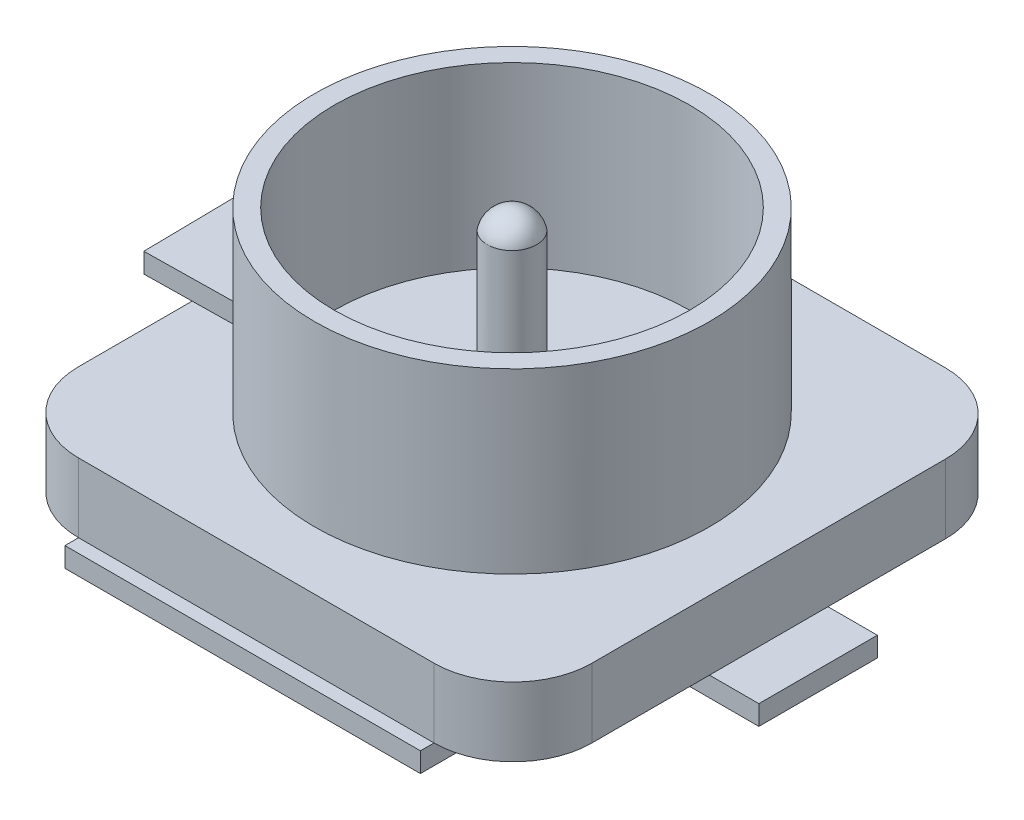
ISO-10303-21;
HEADER;
FILE_DESCRIPTION(('STEP AP214'),'2;1');
FILE_NAME('part.step','',(''),(''),'','','');
FILE_SCHEMA(('AUTOMOTIVE_DESIGN { 1 0 10303 214 1 1 1 1 }'));
ENDSEC;
DATA;
#1=APPLICATION_CONTEXT('core data for automotive mechanical design processes');
#2=APPLICATION_PROTOCOL_DEFINITION('international standard','automotive_design',2000,#1);
#3=PRODUCT_CONTEXT('',#1,'mechanical');
#4=PRODUCT('Part','Part','',(#3));
#5=PRODUCT_RELATED_PRODUCT_CATEGORY('part','',(#4));
#6=PRODUCT_DEFINITION_FORMATION('','',#4);
#7=PRODUCT_DEFINITION_CONTEXT('part definition',#1,'design');
#8=PRODUCT_DEFINITION('design','',#6,#7);
#9=PRODUCT_DEFINITION_SHAPE('','',#8);
#10=(LENGTH_UNIT() NAMED_UNIT(*) SI_UNIT(.MILLI.,.METRE.));
#11=(NAMED_UNIT(*) PLANE_ANGLE_UNIT() SI_UNIT($,.RADIAN.));
#12=(NAMED_UNIT(*) SI_UNIT($,.STERADIAN.) SOLID_ANGLE_UNIT());
#13=UNCERTAINTY_MEASURE_WITH_UNIT(LENGTH_MEASURE(1.E-05),#10,'distance_accuracy_value','');
#14=(GEOMETRIC_REPRESENTATION_CONTEXT(3) GLOBAL_UNCERTAINTY_ASSIGNED_CONTEXT((#13)) GLOBAL_UNIT_ASSIGNED_CONTEXT((#10,
#11,#12)) REPRESENTATION_CONTEXT('',''));
#15=CARTESIAN_POINT('',(0.,0.,0.));
#16=DIRECTION('',(0.,0.,1.));
#17=DIRECTION('',(1.,0.,0.));
#18=AXIS2_PLACEMENT_3D('',#15,#16,#17);
#19=CARTESIAN_POINT('',(0.899999999999999,0.,0.895));
#20=DIRECTION('',(0.,-1.,0.));
#21=DIRECTION('',(0.,0.,-1.));
#22=AXIS2_PLACEMENT_3D('',#19,#20,#21);
#23=PLANE('',#22);
#24=DIRECTION('',(1.,0.,0.));
#25=VECTOR('',#24,1.);
#26=CARTESIAN_POINT('',(0.,0.,0.3));
#27=LINE('',#26,#25);
#28=CARTESIAN_POINT('',(0.264575131106459,0.,0.3));
#29=VERTEX_POINT('',#28);
#30=CARTESIAN_POINT('',(1.3,0.,0.3));
#31=VERTEX_POINT('',#30);
#32=EDGE_CURVE('E272',#29,#31,#27,.T.);
#33=ORIENTED_EDGE('',*,*,#32,.T.);
#34=DIRECTION('',(0.,0.,-1.));
#35=VECTOR('',#34,1.);
#36=CARTESIAN_POINT('',(1.3,0.,0.894999999999997));
#37=LINE('',#36,#35);
#38=CARTESIAN_POINT('',(1.3,0.,0.894999999999997));
#39=VERTEX_POINT('',#38);
#40=EDGE_CURVE('E392',#39,#31,#37,.T.);
#41=ORIENTED_EDGE('',*,*,#40,.F.);
#42=CARTESIAN_POINT('',(0.899999999999999,0.,0.895));
#43=DIRECTION('',(0.,1.,0.));
#44=DIRECTION('',(0.,0.,-1.));
#45=AXIS2_PLACEMENT_3D('',#42,#43,#44);
#46=CIRCLE('',#45,0.4);
#47=CARTESIAN_POINT('',(0.899999999999996,0.,1.295));
#48=VERTEX_POINT('',#47);
#49=EDGE_CURVE('E368',#48,#39,#46,.T.);
#50=ORIENTED_EDGE('',*,*,#49,.F.);
#51=DIRECTION('',(0.,0.,1.));
#52=VECTOR('',#51,1.);
#53=CARTESIAN_POINT('',(0.9,0.,1.36376329659594));
#54=LINE('',#53,#52);
#55=CARTESIAN_POINT('',(0.9,0.,1.05));
#56=VERTEX_POINT('',#55);
#57=EDGE_CURVE('E343',#56,#48,#54,.T.);
#58=ORIENTED_EDGE('',*,*,#57,.F.);
#59=DIRECTION('',(1.,0.,0.));
#60=VECTOR('',#59,1.);
#61=CARTESIAN_POINT('',(-0.899999999999999,0.,1.05));
#62=LINE('',#61,#60);
#63=CARTESIAN_POINT('',(-0.899999999999999,0.,1.05));
#64=VERTEX_POINT('',#63);
#65=EDGE_CURVE('E338',#64,#56,#62,.T.);
#66=ORIENTED_EDGE('',*,*,#65,.F.);
#67=DIRECTION('',(0.,0.,-1.));
#68=VECTOR('',#67,1.);
#69=CARTESIAN_POINT('',(-0.899999999999999,0.,1.36376329659594));
#70=LINE('',#69,#68);
#71=CARTESIAN_POINT('',(-0.899999999999998,0.,1.295));
#72=VERTEX_POINT('',#71);
#73=EDGE_CURVE('E339',#72,#64,#70,.T.);
#74=ORIENTED_EDGE('',*,*,#73,.F.);
#75=CARTESIAN_POINT('',(-0.900000000000001,0.,0.895));
#76=DIRECTION('',(0.,1.,0.));
#77=DIRECTION('',(0.,0.,1.));
#78=AXIS2_PLACEMENT_3D('',#75,#76,#77);
#79=CIRCLE('',#78,0.4);
#80=CARTESIAN_POINT('',(-1.3,0.,0.894999999999997));
#81=VERTEX_POINT('',#80);
#82=EDGE_CURVE('E406',#81,#72,#79,.T.);
#83=ORIENTED_EDGE('',*,*,#82,.F.);
#84=DIRECTION('',(0.,0.,1.));
#85=VECTOR('',#84,1.);
#86=CARTESIAN_POINT('',(-1.3,0.,0.894999999999997));
#87=LINE('',#86,#85);
#88=CARTESIAN_POINT('',(-1.3,0.,-0.894999999999997));
#89=VERTEX_POINT('',#88);
#90=EDGE_CURVE('E404',#89,#81,#87,.T.);
#91=ORIENTED_EDGE('',*,*,#90,.F.);
#92=CARTESIAN_POINT('',(-0.900000000000001,0.,-0.895));
#93=DIRECTION('',(0.,1.,0.));
#94=DIRECTION('',(0.,0.,-1.));
#95=AXIS2_PLACEMENT_3D('',#92,#93,#94);
#96=CIRCLE('',#95,0.4);
#97=CARTESIAN_POINT('',(-0.9,0.,-1.295));
#98=VERTEX_POINT('',#97);
#99=EDGE_CURVE('E402',#98,#89,#96,.T.);
#100=ORIENTED_EDGE('',*,*,#99,.F.);
#101=DIRECTION('',(0.,0.,-1.));
#102=VECTOR('',#101,1.);
#103=CARTESIAN_POINT('',(-0.9,0.,-1.05));
#104=LINE('',#103,#102);
#105=CARTESIAN_POINT('',(-0.9,0.,-1.05));
#106=VERTEX_POINT('',#105);
#107=EDGE_CURVE('E305',#106,#98,#104,.T.);
#108=ORIENTED_EDGE('',*,*,#107,.F.);
#109=DIRECTION('',(-1.,0.,0.));
#110=VECTOR('',#109,1.);
#111=CARTESIAN_POINT('',(-0.9,0.,-1.05));
#112=LINE('',#111,#110);
#113=CARTESIAN_POINT('',(0.9,0.,-1.05));
#114=VERTEX_POINT('',#113);
#115=EDGE_CURVE('E298',#114,#106,#112,.T.);
#116=ORIENTED_EDGE('',*,*,#115,.F.);
#117=DIRECTION('',(0.,0.,-1.));
#118=VECTOR('',#117,1.);
#119=CARTESIAN_POINT('',(0.9,0.,0.895));
#120=LINE('',#119,#118);
#121=CARTESIAN_POINT('',(0.9,0.,-1.295));
#122=VERTEX_POINT('',#121);
#123=EDGE_CURVE('E441',#114,#122,#120,.T.);
#124=ORIENTED_EDGE('',*,*,#123,.T.);
#125=CARTESIAN_POINT('',(0.899999999999999,0.,-0.895));
#126=DIRECTION('',(0.,1.,0.));
#127=DIRECTION('',(0.,0.,-1.));
#128=AXIS2_PLACEMENT_3D('',#125,#126,#127);
#129=CIRCLE('',#128,0.4);
#130=CARTESIAN_POINT('',(1.3,0.,-0.894999999999997));
#131=VERTEX_POINT('',#130);
#132=EDGE_CURVE('E395',#131,#122,#129,.T.);
#133=ORIENTED_EDGE('',*,*,#132,.F.);
#134=CARTESIAN_POINT('',(1.3,0.,-0.299999999999999));
#135=VERTEX_POINT('',#134);
#136=EDGE_CURVE('E391',#135,#131,#37,.T.);
#137=ORIENTED_EDGE('',*,*,#136,.F.);
#138=DIRECTION('',(1.,0.,0.));
#139=VECTOR('',#138,1.);
#140=CARTESIAN_POINT('',(0.,0.,-0.3));
#141=LINE('',#140,#139);
#142=CARTESIAN_POINT('',(0.264575131106459,0.,-0.3));
#143=VERTEX_POINT('',#142);
#144=EDGE_CURVE('E278',#143,#135,#141,.T.);
#145=ORIENTED_EDGE('',*,*,#144,.F.);
#146=CARTESIAN_POINT('',(0.,0.,0.));
#147=DIRECTION('',(0.,-1.,0.));
#148=DIRECTION('',(0.,0.,-1.));
#149=AXIS2_PLACEMENT_3D('',#146,#147,#148);
#150=CIRCLE('',#149,0.4);
#151=EDGE_CURVE('E265',#29,#143,#150,.T.);
#152=ORIENTED_EDGE('',*,*,#151,.F.);
#153=EDGE_LOOP('',(#33,#41,#50,#58,#66,#74,#83,#91,#100,#108,#116,#124,#133,#137,#145,#152));
#154=FACE_BOUND('',#153,.T.);
#155=ADVANCED_FACE('F49',(#154),#23,.T.);
#156=CARTESIAN_POINT('',(0.899999999999999,0.35,0.895));
#157=DIRECTION('',(0.,-1.,0.));
#158=DIRECTION('',(0.,0.,-1.));
#159=AXIS2_PLACEMENT_3D('',#156,#157,#158);
#160=PLANE('',#159);
#161=CARTESIAN_POINT('',(0.,0.35,0.));
#162=DIRECTION('',(0.,1.,0.));
#163=DIRECTION('',(0.,0.,1.));
#164=AXIS2_PLACEMENT_3D('',#161,#162,#163);
#165=CIRCLE('',#164,0.9);
#166=CARTESIAN_POINT('',(0.,0.35,0.9));
#167=VERTEX_POINT('',#166);
#168=EDGE_CURVE('E363',#167,#167,#165,.T.);
#169=ORIENTED_EDGE('',*,*,#168,.T.);
#170=EDGE_LOOP('',(#169));
#171=FACE_BOUND('',#170,.T.);
#172=CARTESIAN_POINT('',(0.,0.35,0.));
#173=DIRECTION('',(0.,-1.,0.));
#174=DIRECTION('',(0.,0.,-1.));
#175=AXIS2_PLACEMENT_3D('',#172,#173,#174);
#176=CIRCLE('',#175,0.125);
#177=CARTESIAN_POINT('',(0.,0.35,-0.125));
#178=VERTEX_POINT('',#177);
#179=EDGE_CURVE('E436',#178,#178,#176,.F.);
#180=ORIENTED_EDGE('',*,*,#179,.F.);
#181=EDGE_LOOP('',(#180));
#182=FACE_BOUND('',#181,.T.);
#183=ADVANCED_FACE('F466',(#171,#182),#160,.F.);
#184=CARTESIAN_POINT('',(0.,0.35,0.));
#185=DIRECTION('',(0.,-1.,0.));
#186=DIRECTION('',(0.,0.,-1.));
#187=AXIS2_PLACEMENT_3D('',#184,#185,#186);
#188=CIRCLE('',#187,1.);
#189=CARTESIAN_POINT('',(-0.949274007413399,0.35,0.314450089599774));
#190=VERTEX_POINT('',#189);
#191=CARTESIAN_POINT('',(-0.958363839400477,0.35,-0.285549910400226));
#192=VERTEX_POINT('',#191);
#193=EDGE_CURVE('E433',#190,#192,#188,.F.);
#194=ORIENTED_EDGE('',*,*,#193,.F.);
#195=DIRECTION('',(-0.999885262742266,0.,0.0151479817411376));
#196=VECTOR('',#195,1.);
#197=CARTESIAN_POINT('',(-0.8953518204745,0.35,0.313633183567024));
#198=LINE('',#197,#196);
#199=CARTESIAN_POINT('',(-1.3,0.35,0.31976349017663));
#200=VERTEX_POINT('',#199);
#201=EDGE_CURVE('E64',#190,#200,#198,.T.);
#202=ORIENTED_EDGE('',*,*,#201,.T.);
#203=DIRECTION('',(0.,0.,1.));
#204=VECTOR('',#203,1.);
#205=CARTESIAN_POINT('',(-1.3,0.35,0.894999999999997));
#206=LINE('',#205,#204);
#207=CARTESIAN_POINT('',(-1.3,0.35,0.894999999999997));
#208=VERTEX_POINT('',#207);
#209=EDGE_CURVE('E381',#200,#208,#206,.T.);
#210=ORIENTED_EDGE('',*,*,#209,.T.);
#211=CARTESIAN_POINT('',(-0.900000000000001,0.35,0.895));
#212=DIRECTION('',(0.,1.,0.));
#213=DIRECTION('',(0.,0.,1.));
#214=AXIS2_PLACEMENT_3D('',#211,#212,#213);
#215=CIRCLE('',#214,0.4);
#216=CARTESIAN_POINT('',(-0.899999999999998,0.35,1.295));
#217=VERTEX_POINT('',#216);
#218=EDGE_CURVE('E384',#208,#217,#215,.T.);
#219=ORIENTED_EDGE('',*,*,#218,.T.);
#220=DIRECTION('',(1.,0.,0.));
#221=VECTOR('',#220,1.);
#222=CARTESIAN_POINT('',(-0.899999999999998,0.35,1.295));
#223=LINE('',#222,#221);
#224=CARTESIAN_POINT('',(0.899999999999996,0.35,1.295));
#225=VERTEX_POINT('',#224);
#226=EDGE_CURVE('E386',#217,#225,#223,.T.);
#227=ORIENTED_EDGE('',*,*,#226,.T.);
#228=CARTESIAN_POINT('',(0.899999999999999,0.35,0.895));
#229=DIRECTION('',(0.,1.,0.));
#230=DIRECTION('',(0.,0.,-1.));
#231=AXIS2_PLACEMENT_3D('',#228,#229,#230);
#232=CIRCLE('',#231,0.4);
#233=CARTESIAN_POINT('',(1.3,0.35,0.894999999999997));
#234=VERTEX_POINT('',#233);
#235=EDGE_CURVE('E369',#225,#234,#232,.T.);
#236=ORIENTED_EDGE('',*,*,#235,.T.);
#237=DIRECTION('',(0.,0.,-1.));
#238=VECTOR('',#237,1.);
#239=CARTESIAN_POINT('',(1.3,0.35,0.894999999999997));
#240=LINE('',#239,#238);
#241=CARTESIAN_POINT('',(1.3,0.35,-0.894999999999997));
#242=VERTEX_POINT('',#241);
#243=EDGE_CURVE('E372',#234,#242,#240,.T.);
#244=ORIENTED_EDGE('',*,*,#243,.T.);
#245=CARTESIAN_POINT('',(0.899999999999999,0.35,-0.895));
#246=DIRECTION('',(0.,1.,0.));
#247=DIRECTION('',(0.,0.,-1.));
#248=AXIS2_PLACEMENT_3D('',#245,#246,#247);
#249=CIRCLE('',#248,0.4);
#250=CARTESIAN_POINT('',(0.899999999999996,0.35,-1.295));
#251=VERTEX_POINT('',#250);
#252=EDGE_CURVE('E375',#242,#251,#249,.T.);
#253=ORIENTED_EDGE('',*,*,#252,.T.);
#254=DIRECTION('',(-1.,0.,0.));
#255=VECTOR('',#254,1.);
#256=CARTESIAN_POINT('',(-0.899999999999998,0.35,-1.295));
#257=LINE('',#256,#255);
#258=CARTESIAN_POINT('',(-0.899999999999998,0.35,-1.295));
#259=VERTEX_POINT('',#258);
#260=EDGE_CURVE('E377',#251,#259,#257,.T.);
#261=ORIENTED_EDGE('',*,*,#260,.T.);
#262=CARTESIAN_POINT('',(-0.900000000000001,0.35,-0.895));
#263=DIRECTION('',(0.,1.,0.));
#264=DIRECTION('',(0.,0.,-1.));
#265=AXIS2_PLACEMENT_3D('',#262,#263,#264);
#266=CIRCLE('',#265,0.4);
#267=CARTESIAN_POINT('',(-1.3,0.35,-0.894999999999997));
#268=VERTEX_POINT('',#267);
#269=EDGE_CURVE('E379',#259,#268,#266,.T.);
#270=ORIENTED_EDGE('',*,*,#269,.T.);
#271=CARTESIAN_POINT('',(-1.3,0.35,-0.280374218232625));
#272=VERTEX_POINT('',#271);
#273=EDGE_CURVE('E382',#268,#272,#206,.T.);
#274=ORIENTED_EDGE('',*,*,#273,.T.);
#275=DIRECTION('',(-0.999885262742266,0.,0.0151479817411375));
#276=VECTOR('',#275,1.);
#277=CARTESIAN_POINT('',(-0.904441652461578,0.35,-0.286366816432976));
#278=LINE('',#277,#276);
#279=EDGE_CURVE('E234',#192,#272,#278,.T.);
#280=ORIENTED_EDGE('',*,*,#279,.F.);
#281=EDGE_LOOP('',(#194,#202,#210,#219,#227,#236,#244,#253,#261,#270,#274,#280));
#282=FACE_BOUND('',#281,.T.);
#283=ADVANCED_FACE('F450',(#282),#160,.F.);
#284=CARTESIAN_POINT('',(0.899999999999999,0.35,0.895));
#285=DIRECTION('',(0.,-1.,0.));
#286=DIRECTION('',(0.,0.,-1.));
#287=AXIS2_PLACEMENT_3D('',#284,#285,#286);
#288=CYLINDRICAL_SURFACE('',#287,0.4);
#289=ORIENTED_EDGE('',*,*,#49,.T.);
#290=DIRECTION('',(0.,-1.,0.));
#291=VECTOR('',#290,1.);
#292=CARTESIAN_POINT('',(1.3,0.35,0.894999999999997));
#293=LINE('',#292,#291);
#294=EDGE_CURVE('E430',#234,#39,#293,.T.);
#295=ORIENTED_EDGE('',*,*,#294,.F.);
#296=ORIENTED_EDGE('',*,*,#235,.F.);
#297=DIRECTION('',(0.,-1.,0.));
#298=VECTOR('',#297,1.);
#299=CARTESIAN_POINT('',(0.899999999999996,0.35,1.295));
#300=LINE('',#299,#298);
#301=EDGE_CURVE('E388',#225,#48,#300,.T.);
#302=ORIENTED_EDGE('',*,*,#301,.T.);
#303=EDGE_LOOP('',(#289,#295,#296,#302));
#304=FACE_BOUND('',#303,.T.);
#305=ADVANCED_FACE('F501',(#304),#288,.T.);
#306=CARTESIAN_POINT('',(1.3,0.35,0.894999999999997));
#307=DIRECTION('',(-1.,0.,0.));
#308=DIRECTION('',(0.,0.,1.));
#309=AXIS2_PLACEMENT_3D('',#306,#307,#308);
#310=PLANE('',#309);
#311=ORIENTED_EDGE('',*,*,#40,.T.);
#312=EDGE_CURVE('E396',#31,#135,#37,.T.);
#313=ORIENTED_EDGE('',*,*,#312,.T.);
#314=ORIENTED_EDGE('',*,*,#136,.T.);
#315=DIRECTION('',(0.,-1.,0.));
#316=VECTOR('',#315,1.);
#317=CARTESIAN_POINT('',(1.3,0.35,-0.894999999999997));
#318=LINE('',#317,#316);
#319=EDGE_CURVE('E427',#242,#131,#318,.T.);
#320=ORIENTED_EDGE('',*,*,#319,.F.);
#321=ORIENTED_EDGE('',*,*,#243,.F.);
#322=ORIENTED_EDGE('',*,*,#294,.T.);
#323=EDGE_LOOP('',(#311,#313,#314,#320,#321,#322));
#324=FACE_BOUND('',#323,.T.);
#325=ADVANCED_FACE('F498',(#324),#310,.F.);
#326=CARTESIAN_POINT('',(0.899999999999999,0.35,-0.895));
#327=DIRECTION('',(0.,-1.,0.));
#328=DIRECTION('',(0.,0.,-1.));
#329=AXIS2_PLACEMENT_3D('',#326,#327,#328);
#330=CYLINDRICAL_SURFACE('',#329,0.4);
#331=ORIENTED_EDGE('',*,*,#132,.T.);
#332=DIRECTION('',(0.,-1.,0.));
#333=VECTOR('',#332,1.);
#334=CARTESIAN_POINT('',(0.899999999999996,0.35,-1.295));
#335=LINE('',#334,#333);
#336=EDGE_CURVE('E424',#251,#122,#335,.T.);
#337=ORIENTED_EDGE('',*,*,#336,.F.);
#338=ORIENTED_EDGE('',*,*,#252,.F.);
#339=ORIENTED_EDGE('',*,*,#319,.T.);
#340=EDGE_LOOP('',(#331,#337,#338,#339));
#341=FACE_BOUND('',#340,.T.);
#342=ADVANCED_FACE('F494',(#341),#330,.T.);
#343=CARTESIAN_POINT('',(-0.899999999999998,0.35,-1.295));
#344=DIRECTION('',(0.,0.,1.));
#345=DIRECTION('',(1.,0.,0.));
#346=AXIS2_PLACEMENT_3D('',#343,#344,#345);
#347=PLANE('',#346);
#348=DIRECTION('',(-1.,0.,0.));
#349=VECTOR('',#348,1.);
#350=CARTESIAN_POINT('',(-0.899999999999998,0.,-1.295));
#351=LINE('',#350,#349);
#352=EDGE_CURVE('E399',#122,#98,#351,.T.);
#353=ORIENTED_EDGE('',*,*,#352,.T.);
#354=DIRECTION('',(0.,-1.,0.));
#355=VECTOR('',#354,1.);
#356=CARTESIAN_POINT('',(-0.899999999999998,0.35,-1.295));
#357=LINE('',#356,#355);
#358=EDGE_CURVE('E421',#259,#98,#357,.T.);
#359=ORIENTED_EDGE('',*,*,#358,.F.);
#360=ORIENTED_EDGE('',*,*,#260,.F.);
#361=ORIENTED_EDGE('',*,*,#336,.T.);
#362=EDGE_LOOP('',(#353,#359,#360,#361));
#363=FACE_BOUND('',#362,.T.);
#364=ADVANCED_FACE('F490',(#363),#347,.F.);
#365=CARTESIAN_POINT('',(-0.900000000000001,0.35,-0.895));
#366=DIRECTION('',(0.,-1.,0.));
#367=DIRECTION('',(0.,0.,-1.));
#368=AXIS2_PLACEMENT_3D('',#365,#366,#367);
#369=CYLINDRICAL_SURFACE('',#368,0.4);
#370=ORIENTED_EDGE('',*,*,#99,.T.);
#371=DIRECTION('',(0.,-1.,0.));
#372=VECTOR('',#371,1.);
#373=CARTESIAN_POINT('',(-1.3,0.35,-0.894999999999997));
#374=LINE('',#373,#372);
#375=EDGE_CURVE('E418',#268,#89,#374,.T.);
#376=ORIENTED_EDGE('',*,*,#375,.F.);
#377=ORIENTED_EDGE('',*,*,#269,.F.);
#378=ORIENTED_EDGE('',*,*,#358,.T.);
#379=EDGE_LOOP('',(#370,#376,#377,#378));
#380=FACE_BOUND('',#379,.T.);
#381=ADVANCED_FACE('F487',(#380),#369,.T.);
#382=CARTESIAN_POINT('',(-1.3,0.35,0.894999999999997));
#383=DIRECTION('',(1.,0.,0.));
#384=DIRECTION('',(0.,0.,-1.));
#385=AXIS2_PLACEMENT_3D('',#382,#383,#384);
#386=PLANE('',#385);
#387=ORIENTED_EDGE('',*,*,#90,.T.);
#388=DIRECTION('',(0.,-1.,0.));
#389=VECTOR('',#388,1.);
#390=CARTESIAN_POINT('',(-1.3,0.35,0.894999999999997));
#391=LINE('',#390,#389);
#392=EDGE_CURVE('E415',#208,#81,#391,.T.);
#393=ORIENTED_EDGE('',*,*,#392,.F.);
#394=ORIENTED_EDGE('',*,*,#209,.F.);
#395=DIRECTION('',(0.,0.,-1.));
#396=VECTOR('',#395,1.);
#397=CARTESIAN_POINT('',(-1.3,0.35,0.894999999999997));
#398=LINE('',#397,#396);
#399=EDGE_CURVE('E71',#200,#272,#398,.T.);
#400=ORIENTED_EDGE('',*,*,#399,.T.);
#401=ORIENTED_EDGE('',*,*,#273,.F.);
#402=ORIENTED_EDGE('',*,*,#375,.T.);
#403=EDGE_LOOP('',(#387,#393,#394,#400,#401,#402));
#404=FACE_BOUND('',#403,.T.);
#405=ADVANCED_FACE('F483',(#404),#386,.F.);
#406=CARTESIAN_POINT('',(-0.900000000000001,0.35,0.895));
#407=DIRECTION('',(0.,-1.,0.));
#408=DIRECTION('',(0.,0.,-1.));
#409=AXIS2_PLACEMENT_3D('',#406,#407,#408);
#410=CYLINDRICAL_SURFACE('',#409,0.4);
#411=ORIENTED_EDGE('',*,*,#82,.T.);
#412=DIRECTION('',(0.,-1.,0.));
#413=VECTOR('',#412,1.);
#414=CARTESIAN_POINT('',(-0.899999999999998,0.35,1.295));
#415=LINE('',#414,#413);
#416=EDGE_CURVE('E412',#217,#72,#415,.T.);
#417=ORIENTED_EDGE('',*,*,#416,.F.);
#418=ORIENTED_EDGE('',*,*,#218,.F.);
#419=ORIENTED_EDGE('',*,*,#392,.T.);
#420=EDGE_LOOP('',(#411,#417,#418,#419));
#421=FACE_BOUND('',#420,.T.);
#422=ADVANCED_FACE('F480',(#421),#410,.T.);
#423=CARTESIAN_POINT('',(-0.899999999999998,0.35,1.295));
#424=DIRECTION('',(0.,0.,-1.));
#425=DIRECTION('',(-1.,0.,0.));
#426=AXIS2_PLACEMENT_3D('',#423,#424,#425);
#427=PLANE('',#426);
#428=DIRECTION('',(1.,0.,0.));
#429=VECTOR('',#428,1.);
#430=CARTESIAN_POINT('',(-0.899999999999998,0.,1.295));
#431=LINE('',#430,#429);
#432=EDGE_CURVE('E373',#72,#48,#431,.T.);
#433=ORIENTED_EDGE('',*,*,#432,.T.);
#434=ORIENTED_EDGE('',*,*,#301,.F.);
#435=ORIENTED_EDGE('',*,*,#226,.F.);
#436=ORIENTED_EDGE('',*,*,#416,.T.);
#437=EDGE_LOOP('',(#433,#434,#435,#436));
#438=FACE_BOUND('',#437,.T.);
#439=ADVANCED_FACE('F476',(#438),#427,.F.);
#440=CARTESIAN_POINT('',(0.,1.25,0.));
#441=DIRECTION('',(0.,1.,0.));
#442=DIRECTION('',(0.,0.,1.));
#443=AXIS2_PLACEMENT_3D('',#440,#441,#442);
#444=PLANE('',#443);
#445=CARTESIAN_POINT('',(0.,1.25,0.));
#446=DIRECTION('',(0.,1.,0.));
#447=DIRECTION('',(0.,0.,1.));
#448=AXIS2_PLACEMENT_3D('',#445,#446,#447);
#449=CIRCLE('',#448,1.);
#450=CARTESIAN_POINT('',(0.,1.25,1.));
#451=VERTEX_POINT('',#450);
#452=EDGE_CURVE('E362',#451,#451,#449,.T.);
#453=ORIENTED_EDGE('',*,*,#452,.T.);
#454=EDGE_LOOP('',(#453));
#455=FACE_BOUND('',#454,.T.);
#456=CARTESIAN_POINT('',(0.,1.25,0.));
#457=DIRECTION('',(0.,1.,0.));
#458=DIRECTION('',(0.,0.,1.));
#459=AXIS2_PLACEMENT_3D('',#456,#457,#458);
#460=CIRCLE('',#459,0.9);
#461=CARTESIAN_POINT('',(0.,1.25,0.9));
#462=VERTEX_POINT('',#461);
#463=EDGE_CURVE('E359',#462,#462,#460,.T.);
#464=ORIENTED_EDGE('',*,*,#463,.F.);
#465=EDGE_LOOP('',(#464));
#466=FACE_BOUND('',#465,.T.);
#467=ADVANCED_FACE('F479',(#455,#466),#444,.T.);
#468=CARTESIAN_POINT('',(0.,1.25,0.));
#469=DIRECTION('',(0.,-1.,0.));
#470=DIRECTION('',(0.,0.,-1.));
#471=AXIS2_PLACEMENT_3D('',#468,#469,#470);
#472=CYLINDRICAL_SURFACE('',#471,1.);
#473=CARTESIAN_POINT('',(0.,0.45,0.));
#474=DIRECTION('',(0.,-1.,0.));
#475=DIRECTION('',(0.,0.,-1.));
#476=AXIS2_PLACEMENT_3D('',#473,#474,#475);
#477=CIRCLE('',#476,1.);
#478=CARTESIAN_POINT('',(-0.949274007413399,0.45,0.314450089599774));
#479=VERTEX_POINT('',#478);
#480=CARTESIAN_POINT('',(-0.958363839400477,0.45,-0.285549910400226));
#481=VERTEX_POINT('',#480);
#482=EDGE_CURVE('E258',#479,#481,#477,.T.);
#483=ORIENTED_EDGE('',*,*,#482,.F.);
#484=DIRECTION('',(0.,-1.,0.));
#485=VECTOR('',#484,1.);
#486=CARTESIAN_POINT('',(-0.949274007413399,1.25,0.314450089599774));
#487=LINE('',#486,#485);
#488=EDGE_CURVE('E12',#479,#190,#487,.T.);
#489=ORIENTED_EDGE('',*,*,#488,.T.);
#490=ORIENTED_EDGE('',*,*,#193,.T.);
#491=DIRECTION('',(0.,-1.,0.));
#492=VECTOR('',#491,1.);
#493=CARTESIAN_POINT('',(-0.958363839400477,1.25,-0.285549910400226));
#494=LINE('',#493,#492);
#495=EDGE_CURVE('E57',#481,#192,#494,.T.);
#496=ORIENTED_EDGE('',*,*,#495,.F.);
#497=EDGE_LOOP('',(#483,#489,#490,#496));
#498=FACE_BOUND('',#497,.T.);
#499=ORIENTED_EDGE('',*,*,#452,.F.);
#500=EDGE_LOOP('',(#499));
#501=FACE_BOUND('',#500,.T.);
#502=ADVANCED_FACE('F448',(#498,#501),#472,.T.);
#503=CARTESIAN_POINT('',(0.,1.25,0.));
#504=DIRECTION('',(0.,-1.,0.));
#505=DIRECTION('',(0.,0.,-1.));
#506=AXIS2_PLACEMENT_3D('',#503,#504,#505);
#507=CYLINDRICAL_SURFACE('',#506,0.9);
#508=ORIENTED_EDGE('',*,*,#168,.F.);
#509=EDGE_LOOP('',(#508));
#510=FACE_BOUND('',#509,.T.);
#511=ORIENTED_EDGE('',*,*,#463,.T.);
#512=EDGE_LOOP('',(#511));
#513=FACE_BOUND('',#512,.T.);
#514=ADVANCED_FACE('F560',(#510,#513),#507,.F.);
#515=CARTESIAN_POINT('',(0.,1.15,0.));
#516=DIRECTION('',(0.,-1.,0.));
#517=DIRECTION('',(0.,0.,-1.));
#518=AXIS2_PLACEMENT_3D('',#515,#516,#517);
#519=CYLINDRICAL_SURFACE('',#518,0.125);
#520=CARTESIAN_POINT('',(0.,1.15,0.));
#521=DIRECTION('',(0.,1.,0.));
#522=DIRECTION('',(0.,0.,1.));
#523=AXIS2_PLACEMENT_3D('',#520,#521,#522);
#524=CIRCLE('',#523,0.125);
#525=CARTESIAN_POINT('',(0.,1.15,0.125));
#526=VERTEX_POINT('',#525);
#527=EDGE_CURVE('E358',#526,#526,#524,.T.);
#528=ORIENTED_EDGE('',*,*,#527,.F.);
#529=EDGE_LOOP('',(#528));
#530=FACE_BOUND('',#529,.T.);
#531=ORIENTED_EDGE('',*,*,#179,.T.);
#532=EDGE_LOOP('',(#531));
#533=FACE_BOUND('',#532,.T.);
#534=ADVANCED_FACE('F557',(#530,#533),#519,.T.);
#535=CARTESIAN_POINT('',(0.,1.121875,0.));
#536=DIRECTION('',(0.,0.,1.));
#537=DIRECTION('',(1.,0.,0.));
#538=AXIS2_PLACEMENT_3D('',#535,#536,#537);
#539=SPHERICAL_SURFACE('',#538,0.128125);
#540=CARTESIAN_POINT('',(0.,1.121875,0.));
#541=DIRECTION('',(0.,1.,0.));
#542=DIRECTION('',(0.,0.,1.));
#543=AXIS2_PLACEMENT_3D('',#540,#541,#542);
#544=SPHERICAL_SURFACE('',#543,0.128125);
#545=ORIENTED_EDGE('',*,*,#527,.T.);
#546=EDGE_LOOP('',(#545));
#547=FACE_BOUND('',#546,.T.);
#548=ADVANCED_FACE('F51',(#547),#544,.T.);
#549=CARTESIAN_POINT('',(-0.899999999999999,-0.1,1.36376329659594));
#550=DIRECTION('',(1.,0.,0.));
#551=DIRECTION('',(0.,0.,-1.));
#552=AXIS2_PLACEMENT_3D('',#549,#550,#551);
#553=PLANE('',#552);
#554=CARTESIAN_POINT('',(-0.899999999999999,0.,1.36376329659594));
#555=VERTEX_POINT('',#554);
#556=EDGE_CURVE('E324',#555,#72,#70,.T.);
#557=ORIENTED_EDGE('',*,*,#556,.T.);
#558=ORIENTED_EDGE('',*,*,#73,.T.);
#559=DIRECTION('',(0.,1.,0.));
#560=VECTOR('',#559,1.);
#561=CARTESIAN_POINT('',(-0.899999999999999,-0.1,1.05));
#562=LINE('',#561,#560);
#563=CARTESIAN_POINT('',(-0.899999999999999,-0.1,1.05));
#564=VERTEX_POINT('',#563);
#565=EDGE_CURVE('E355',#564,#64,#562,.T.);
#566=ORIENTED_EDGE('',*,*,#565,.F.);
#567=DIRECTION('',(0.,0.,-1.));
#568=VECTOR('',#567,1.);
#569=CARTESIAN_POINT('',(-0.899999999999999,-0.1,1.36376329659594));
#570=LINE('',#569,#568);
#571=CARTESIAN_POINT('',(-0.899999999999999,-0.1,1.36376329659594));
#572=VERTEX_POINT('',#571);
#573=EDGE_CURVE('E325',#572,#564,#570,.T.);
#574=ORIENTED_EDGE('',*,*,#573,.F.);
#575=DIRECTION('',(0.,1.,0.));
#576=VECTOR('',#575,1.);
#577=CARTESIAN_POINT('',(-0.899999999999999,-0.1,1.36376329659594));
#578=LINE('',#577,#576);
#579=EDGE_CURVE('E335',#572,#555,#578,.T.);
#580=ORIENTED_EDGE('',*,*,#579,.T.);
#581=EDGE_LOOP('',(#557,#558,#566,#574,#580));
#582=FACE_BOUND('',#581,.T.);
#583=ADVANCED_FACE('F530',(#582),#553,.F.);
#584=CARTESIAN_POINT('',(-0.899999999999999,-0.1,1.05));
#585=DIRECTION('',(0.,0.,1.));
#586=DIRECTION('',(1.,0.,0.));
#587=AXIS2_PLACEMENT_3D('',#584,#585,#586);
#588=PLANE('',#587);
#589=ORIENTED_EDGE('',*,*,#65,.T.);
#590=DIRECTION('',(0.,1.,0.));
#591=VECTOR('',#590,1.);
#592=CARTESIAN_POINT('',(0.9,-0.1,1.05));
#593=LINE('',#592,#591);
#594=CARTESIAN_POINT('',(0.9,-0.1,1.05));
#595=VERTEX_POINT('',#594);
#596=EDGE_CURVE('E352',#595,#56,#593,.T.);
#597=ORIENTED_EDGE('',*,*,#596,.F.);
#598=DIRECTION('',(1.,0.,0.));
#599=VECTOR('',#598,1.);
#600=CARTESIAN_POINT('',(-0.899999999999999,-0.1,1.05));
#601=LINE('',#600,#599);
#602=EDGE_CURVE('E328',#564,#595,#601,.T.);
#603=ORIENTED_EDGE('',*,*,#602,.F.);
#604=ORIENTED_EDGE('',*,*,#565,.T.);
#605=EDGE_LOOP('',(#589,#597,#603,#604));
#606=FACE_BOUND('',#605,.T.);
#607=ADVANCED_FACE('F525',(#606),#588,.F.);
#608=CARTESIAN_POINT('',(0.9,-0.1,1.36376329659594));
#609=DIRECTION('',(-1.,0.,0.));
#610=DIRECTION('',(0.,0.,1.));
#611=AXIS2_PLACEMENT_3D('',#608,#609,#610);
#612=PLANE('',#611);
#613=ORIENTED_EDGE('',*,*,#57,.T.);
#614=CARTESIAN_POINT('',(0.9,0.,1.36376329659594));
#615=VERTEX_POINT('',#614);
#616=EDGE_CURVE('E342',#48,#615,#54,.T.);
#617=ORIENTED_EDGE('',*,*,#616,.T.);
#618=DIRECTION('',(0.,1.,0.));
#619=VECTOR('',#618,1.);
#620=CARTESIAN_POINT('',(0.9,-0.1,1.36376329659594));
#621=LINE('',#620,#619);
#622=CARTESIAN_POINT('',(0.9,-0.1,1.36376329659594));
#623=VERTEX_POINT('',#622);
#624=EDGE_CURVE('E349',#623,#615,#621,.T.);
#625=ORIENTED_EDGE('',*,*,#624,.F.);
#626=DIRECTION('',(0.,0.,1.));
#627=VECTOR('',#626,1.);
#628=CARTESIAN_POINT('',(0.9,-0.1,1.36376329659594));
#629=LINE('',#628,#627);
#630=EDGE_CURVE('E331',#595,#623,#629,.T.);
#631=ORIENTED_EDGE('',*,*,#630,.F.);
#632=ORIENTED_EDGE('',*,*,#596,.T.);
#633=EDGE_LOOP('',(#613,#617,#625,#631,#632));
#634=FACE_BOUND('',#633,.T.);
#635=ADVANCED_FACE('F521',(#634),#612,.F.);
#636=CARTESIAN_POINT('',(-0.899999999999999,-0.1,1.36376329659594));
#637=DIRECTION('',(0.,0.,-1.));
#638=DIRECTION('',(-1.,0.,0.));
#639=AXIS2_PLACEMENT_3D('',#636,#637,#638);
#640=PLANE('',#639);
#641=DIRECTION('',(-1.,0.,0.));
#642=VECTOR('',#641,1.);
#643=CARTESIAN_POINT('',(-0.899999999999999,0.,1.36376329659594));
#644=LINE('',#643,#642);
#645=EDGE_CURVE('E329',#615,#555,#644,.T.);
#646=ORIENTED_EDGE('',*,*,#645,.T.);
#647=ORIENTED_EDGE('',*,*,#579,.F.);
#648=DIRECTION('',(-1.,0.,0.));
#649=VECTOR('',#648,1.);
#650=CARTESIAN_POINT('',(-0.899999999999999,-0.1,1.36376329659594));
#651=LINE('',#650,#649);
#652=EDGE_CURVE('E333',#623,#572,#651,.T.);
#653=ORIENTED_EDGE('',*,*,#652,.F.);
#654=ORIENTED_EDGE('',*,*,#624,.T.);
#655=EDGE_LOOP('',(#646,#647,#653,#654));
#656=FACE_BOUND('',#655,.T.);
#657=ADVANCED_FACE('F535',(#656),#640,.F.);
#658=CARTESIAN_POINT('',(-0.899999999999999,-0.1,1.05));
#659=DIRECTION('',(0.,-1.,0.));
#660=DIRECTION('',(0.,0.,-1.));
#661=AXIS2_PLACEMENT_3D('',#658,#659,#660);
#662=PLANE('',#661);
#663=ORIENTED_EDGE('',*,*,#573,.T.);
#664=ORIENTED_EDGE('',*,*,#602,.T.);
#665=ORIENTED_EDGE('',*,*,#630,.T.);
#666=ORIENTED_EDGE('',*,*,#652,.T.);
#667=EDGE_LOOP('',(#663,#664,#665,#666));
#668=FACE_BOUND('',#667,.T.);
#669=ADVANCED_FACE('F537',(#668),#662,.T.);
#670=CARTESIAN_POINT('',(-0.899999999999999,0.,1.05));
#671=DIRECTION('',(0.,-1.,0.));
#672=DIRECTION('',(0.,0.,-1.));
#673=AXIS2_PLACEMENT_3D('',#670,#671,#672);
#674=PLANE('',#673);
#675=ORIENTED_EDGE('',*,*,#432,.F.);
#676=ORIENTED_EDGE('',*,*,#556,.F.);
#677=ORIENTED_EDGE('',*,*,#645,.F.);
#678=ORIENTED_EDGE('',*,*,#616,.F.);
#679=EDGE_LOOP('',(#675,#676,#677,#678));
#680=FACE_BOUND('',#679,.T.);
#681=ADVANCED_FACE('F517',(#680),#674,.F.);
#682=CARTESIAN_POINT('',(-0.9,0.,-1.36376329659594));
#683=DIRECTION('',(0.,-1.,0.));
#684=DIRECTION('',(0.,0.,-1.));
#685=AXIS2_PLACEMENT_3D('',#682,#683,#684);
#686=PLANE('',#685);
#687=CARTESIAN_POINT('',(-0.9,0.,-1.36376329659594));
#688=VERTEX_POINT('',#687);
#689=EDGE_CURVE('E293',#98,#688,#104,.T.);
#690=ORIENTED_EDGE('',*,*,#689,.F.);
#691=ORIENTED_EDGE('',*,*,#352,.F.);
#692=DIRECTION('',(0.,0.,1.));
#693=VECTOR('',#692,1.);
#694=CARTESIAN_POINT('',(0.9,0.,-1.05));
#695=LINE('',#694,#693);
#696=CARTESIAN_POINT('',(0.9,0.,-1.36376329659594));
#697=VERTEX_POINT('',#696);
#698=EDGE_CURVE('E310',#697,#122,#695,.T.);
#699=ORIENTED_EDGE('',*,*,#698,.F.);
#700=DIRECTION('',(1.,0.,0.));
#701=VECTOR('',#700,1.);
#702=CARTESIAN_POINT('',(-0.9,0.,-1.36376329659594));
#703=LINE('',#702,#701);
#704=EDGE_CURVE('E308',#688,#697,#703,.T.);
#705=ORIENTED_EDGE('',*,*,#704,.F.);
#706=EDGE_LOOP('',(#690,#691,#699,#705));
#707=FACE_BOUND('',#706,.T.);
#708=ADVANCED_FACE('F545',(#707),#686,.F.);
#709=CARTESIAN_POINT('',(-0.9,-0.1,-1.05));
#710=DIRECTION('',(1.,0.,0.));
#711=DIRECTION('',(0.,0.,-1.));
#712=AXIS2_PLACEMENT_3D('',#709,#710,#711);
#713=PLANE('',#712);
#714=ORIENTED_EDGE('',*,*,#107,.T.);
#715=ORIENTED_EDGE('',*,*,#689,.T.);
#716=DIRECTION('',(0.,1.,0.));
#717=VECTOR('',#716,1.);
#718=CARTESIAN_POINT('',(-0.9,-0.1,-1.36376329659594));
#719=LINE('',#718,#717);
#720=CARTESIAN_POINT('',(-0.9,-0.1,-1.36376329659594));
#721=VERTEX_POINT('',#720);
#722=EDGE_CURVE('E321',#721,#688,#719,.T.);
#723=ORIENTED_EDGE('',*,*,#722,.F.);
#724=DIRECTION('',(0.,0.,-1.));
#725=VECTOR('',#724,1.);
#726=CARTESIAN_POINT('',(-0.9,-0.1,-1.05));
#727=LINE('',#726,#725);
#728=CARTESIAN_POINT('',(-0.9,-0.1,-1.05));
#729=VERTEX_POINT('',#728);
#730=EDGE_CURVE('E294',#729,#721,#727,.T.);
#731=ORIENTED_EDGE('',*,*,#730,.F.);
#732=DIRECTION('',(0.,1.,0.));
#733=VECTOR('',#732,1.);
#734=CARTESIAN_POINT('',(-0.9,-0.1,-1.05));
#735=LINE('',#734,#733);
#736=EDGE_CURVE('E304',#729,#106,#735,.T.);
#737=ORIENTED_EDGE('',*,*,#736,.T.);
#738=EDGE_LOOP('',(#714,#715,#723,#731,#737));
#739=FACE_BOUND('',#738,.T.);
#740=ADVANCED_FACE('F550',(#739),#713,.F.);
#741=CARTESIAN_POINT('',(-0.9,-0.1,-1.36376329659594));
#742=DIRECTION('',(0.,0.,1.));
#743=DIRECTION('',(1.,0.,0.));
#744=AXIS2_PLACEMENT_3D('',#741,#742,#743);
#745=PLANE('',#744);
#746=ORIENTED_EDGE('',*,*,#704,.T.);
#747=DIRECTION('',(0.,1.,0.));
#748=VECTOR('',#747,1.);
#749=CARTESIAN_POINT('',(0.9,-0.1,-1.36376329659594));
#750=LINE('',#749,#748);
#751=CARTESIAN_POINT('',(0.9,-0.1,-1.36376329659594));
#752=VERTEX_POINT('',#751);
#753=EDGE_CURVE('E318',#752,#697,#750,.T.);
#754=ORIENTED_EDGE('',*,*,#753,.F.);
#755=DIRECTION('',(1.,0.,0.));
#756=VECTOR('',#755,1.);
#757=CARTESIAN_POINT('',(-0.9,-0.1,-1.36376329659594));
#758=LINE('',#757,#756);
#759=EDGE_CURVE('E297',#721,#752,#758,.T.);
#760=ORIENTED_EDGE('',*,*,#759,.F.);
#761=ORIENTED_EDGE('',*,*,#722,.T.);
#762=EDGE_LOOP('',(#746,#754,#760,#761));
#763=FACE_BOUND('',#762,.T.);
#764=ADVANCED_FACE('F590',(#763),#745,.F.);
#765=CARTESIAN_POINT('',(0.9,-0.1,-1.05));
#766=DIRECTION('',(-1.,0.,0.));
#767=DIRECTION('',(0.,0.,1.));
#768=AXIS2_PLACEMENT_3D('',#765,#766,#767);
#769=PLANE('',#768);
#770=ORIENTED_EDGE('',*,*,#698,.T.);
#771=ORIENTED_EDGE('',*,*,#123,.F.);
#772=DIRECTION('',(0.,1.,0.));
#773=VECTOR('',#772,1.);
#774=CARTESIAN_POINT('',(0.9,-0.1,-1.05));
#775=LINE('',#774,#773);
#776=CARTESIAN_POINT('',(0.9,-0.1,-1.05));
#777=VERTEX_POINT('',#776);
#778=EDGE_CURVE('E316',#777,#114,#775,.T.);
#779=ORIENTED_EDGE('',*,*,#778,.F.);
#780=DIRECTION('',(0.,0.,1.));
#781=VECTOR('',#780,1.);
#782=CARTESIAN_POINT('',(0.9,-0.1,-1.05));
#783=LINE('',#782,#781);
#784=EDGE_CURVE('E300',#752,#777,#783,.T.);
#785=ORIENTED_EDGE('',*,*,#784,.F.);
#786=ORIENTED_EDGE('',*,*,#753,.T.);
#787=EDGE_LOOP('',(#770,#771,#779,#785,#786));
#788=FACE_BOUND('',#787,.T.);
#789=ADVANCED_FACE('F580',(#788),#769,.F.);
#790=CARTESIAN_POINT('',(-0.9,-0.1,-1.05));
#791=DIRECTION('',(0.,0.,-1.));
#792=DIRECTION('',(-1.,0.,0.));
#793=AXIS2_PLACEMENT_3D('',#790,#791,#792);
#794=PLANE('',#793);
#795=ORIENTED_EDGE('',*,*,#115,.T.);
#796=ORIENTED_EDGE('',*,*,#736,.F.);
#797=DIRECTION('',(-1.,0.,0.));
#798=VECTOR('',#797,1.);
#799=CARTESIAN_POINT('',(-0.9,-0.1,-1.05));
#800=LINE('',#799,#798);
#801=EDGE_CURVE('E302',#777,#729,#800,.T.);
#802=ORIENTED_EDGE('',*,*,#801,.F.);
#803=ORIENTED_EDGE('',*,*,#778,.T.);
#804=EDGE_LOOP('',(#795,#796,#802,#803));
#805=FACE_BOUND('',#804,.T.);
#806=ADVANCED_FACE('F575',(#805),#794,.F.);
#807=CARTESIAN_POINT('',(-0.9,-0.1,-1.36376329659594));
#808=DIRECTION('',(0.,-1.,0.));
#809=DIRECTION('',(0.,0.,-1.));
#810=AXIS2_PLACEMENT_3D('',#807,#808,#809);
#811=PLANE('',#810);
#812=ORIENTED_EDGE('',*,*,#730,.T.);
#813=ORIENTED_EDGE('',*,*,#759,.T.);
#814=ORIENTED_EDGE('',*,*,#784,.T.);
#815=ORIENTED_EDGE('',*,*,#801,.T.);
#816=EDGE_LOOP('',(#812,#813,#814,#815));
#817=FACE_BOUND('',#816,.T.);
#818=ADVANCED_FACE('F579',(#817),#811,.T.);
#819=CARTESIAN_POINT('',(0.,0.,0.));
#820=DIRECTION('',(0.,-1.,0.));
#821=DIRECTION('',(0.,0.,-1.));
#822=AXIS2_PLACEMENT_3D('',#819,#820,#821);
#823=PLANE('',#822);
#824=CARTESIAN_POINT('',(1.55,0.,-0.299999999999999));
#825=VERTEX_POINT('',#824);
#826=EDGE_CURVE('E260',#135,#825,#141,.T.);
#827=ORIENTED_EDGE('',*,*,#826,.F.);
#828=ORIENTED_EDGE('',*,*,#312,.F.);
#829=CARTESIAN_POINT('',(1.55,0.,0.3));
#830=VERTEX_POINT('',#829);
#831=EDGE_CURVE('E283',#31,#830,#27,.T.);
#832=ORIENTED_EDGE('',*,*,#831,.T.);
#833=DIRECTION('',(0.,0.,-1.));
#834=VECTOR('',#833,1.);
#835=CARTESIAN_POINT('',(1.55,0.,0.3));
#836=LINE('',#835,#834);
#837=EDGE_CURVE('E280',#830,#825,#836,.T.);
#838=ORIENTED_EDGE('',*,*,#837,.T.);
#839=EDGE_LOOP('',(#827,#828,#832,#838));
#840=FACE_BOUND('',#839,.T.);
#841=ADVANCED_FACE('F608',(#840),#823,.F.);
#842=CARTESIAN_POINT('',(0.,-0.1,0.));
#843=DIRECTION('',(0.,-1.,0.));
#844=DIRECTION('',(0.,0.,-1.));
#845=AXIS2_PLACEMENT_3D('',#842,#843,#844);
#846=PLANE('',#845);
#847=CARTESIAN_POINT('',(0.,-0.1,0.));
#848=DIRECTION('',(0.,-1.,0.));
#849=DIRECTION('',(0.,0.,-1.));
#850=AXIS2_PLACEMENT_3D('',#847,#848,#849);
#851=CIRCLE('',#850,0.4);
#852=CARTESIAN_POINT('',(0.264575131106459,-0.1,0.3));
#853=VERTEX_POINT('',#852);
#854=CARTESIAN_POINT('',(0.264575131106459,-0.1,-0.3));
#855=VERTEX_POINT('',#854);
#856=EDGE_CURVE('E261',#853,#855,#851,.T.);
#857=ORIENTED_EDGE('',*,*,#856,.T.);
#858=DIRECTION('',(1.,0.,0.));
#859=VECTOR('',#858,1.);
#860=CARTESIAN_POINT('',(0.,-0.1,-0.3));
#861=LINE('',#860,#859);
#862=CARTESIAN_POINT('',(1.55,-0.1,-0.299999999999999));
#863=VERTEX_POINT('',#862);
#864=EDGE_CURVE('E269',#855,#863,#861,.T.);
#865=ORIENTED_EDGE('',*,*,#864,.T.);
#866=DIRECTION('',(0.,0.,-1.));
#867=VECTOR('',#866,1.);
#868=CARTESIAN_POINT('',(1.55,-0.1,0.3));
#869=LINE('',#868,#867);
#870=CARTESIAN_POINT('',(1.55,-0.1,0.3));
#871=VERTEX_POINT('',#870);
#872=EDGE_CURVE('E271',#871,#863,#869,.T.);
#873=ORIENTED_EDGE('',*,*,#872,.F.);
#874=DIRECTION('',(1.,0.,0.));
#875=VECTOR('',#874,1.);
#876=CARTESIAN_POINT('',(0.,-0.1,0.3));
#877=LINE('',#876,#875);
#878=EDGE_CURVE('E275',#853,#871,#877,.T.);
#879=ORIENTED_EDGE('',*,*,#878,.F.);
#880=EDGE_LOOP('',(#857,#865,#873,#879));
#881=FACE_BOUND('',#880,.T.);
#882=ADVANCED_FACE('F783',(#881),#846,.T.);
#883=CARTESIAN_POINT('',(0.,-0.1,0.));
#884=DIRECTION('',(0.,1.,0.));
#885=DIRECTION('',(0.,0.,1.));
#886=AXIS2_PLACEMENT_3D('',#883,#884,#885);
#887=CYLINDRICAL_SURFACE('',#886,0.4);
#888=DIRECTION('',(0.,1.,0.));
#889=VECTOR('',#888,1.);
#890=CARTESIAN_POINT('',(0.264575131106459,-0.1,-0.3));
#891=LINE('',#890,#889);
#892=EDGE_CURVE('E291',#855,#143,#891,.T.);
#893=ORIENTED_EDGE('',*,*,#892,.F.);
#894=ORIENTED_EDGE('',*,*,#856,.F.);
#895=DIRECTION('',(0.,1.,0.));
#896=VECTOR('',#895,1.);
#897=CARTESIAN_POINT('',(0.264575131106459,-0.1,0.3));
#898=LINE('',#897,#896);
#899=EDGE_CURVE('E264',#853,#29,#898,.T.);
#900=ORIENTED_EDGE('',*,*,#899,.T.);
#901=ORIENTED_EDGE('',*,*,#151,.T.);
#902=EDGE_LOOP('',(#893,#894,#900,#901));
#903=FACE_BOUND('',#902,.T.);
#904=ADVANCED_FACE('F786',(#903),#887,.T.);
#905=CARTESIAN_POINT('',(1.55,-0.1,0.3));
#906=DIRECTION('',(1.,0.,0.));
#907=DIRECTION('',(0.,0.,-1.));
#908=AXIS2_PLACEMENT_3D('',#905,#906,#907);
#909=PLANE('',#908);
#910=ORIENTED_EDGE('',*,*,#837,.F.);
#911=DIRECTION('',(0.,1.,0.));
#912=VECTOR('',#911,1.);
#913=CARTESIAN_POINT('',(1.55,-0.1,0.3));
#914=LINE('',#913,#912);
#915=EDGE_CURVE('E277',#871,#830,#914,.T.);
#916=ORIENTED_EDGE('',*,*,#915,.F.);
#917=ORIENTED_EDGE('',*,*,#872,.T.);
#918=DIRECTION('',(0.,1.,0.));
#919=VECTOR('',#918,1.);
#920=CARTESIAN_POINT('',(1.55,-0.1,-0.299999999999999));
#921=LINE('',#920,#919);
#922=EDGE_CURVE('E268',#863,#825,#921,.T.);
#923=ORIENTED_EDGE('',*,*,#922,.T.);
#924=EDGE_LOOP('',(#910,#916,#917,#923));
#925=FACE_BOUND('',#924,.T.);
#926=ADVANCED_FACE('F663',(#925),#909,.T.);
#927=CARTESIAN_POINT('',(0.,-0.1,0.3));
#928=DIRECTION('',(0.,0.,1.));
#929=DIRECTION('',(1.,0.,0.));
#930=AXIS2_PLACEMENT_3D('',#927,#928,#929);
#931=PLANE('',#930);
#932=ORIENTED_EDGE('',*,*,#899,.F.);
#933=ORIENTED_EDGE('',*,*,#878,.T.);
#934=ORIENTED_EDGE('',*,*,#915,.T.);
#935=ORIENTED_EDGE('',*,*,#831,.F.);
#936=ORIENTED_EDGE('',*,*,#32,.F.);
#937=EDGE_LOOP('',(#932,#933,#934,#935,#936));
#938=FACE_BOUND('',#937,.T.);
#939=ADVANCED_FACE('F817',(#938),#931,.T.);
#940=CARTESIAN_POINT('',(0.,-0.1,-0.3));
#941=DIRECTION('',(0.,0.,1.));
#942=DIRECTION('',(1.,0.,0.));
#943=AXIS2_PLACEMENT_3D('',#940,#941,#942);
#944=PLANE('',#943);
#945=ORIENTED_EDGE('',*,*,#864,.F.);
#946=ORIENTED_EDGE('',*,*,#892,.T.);
#947=ORIENTED_EDGE('',*,*,#144,.T.);
#948=ORIENTED_EDGE('',*,*,#826,.T.);
#949=ORIENTED_EDGE('',*,*,#922,.F.);
#950=EDGE_LOOP('',(#945,#946,#947,#948,#949));
#951=FACE_BOUND('',#950,.T.);
#952=ADVANCED_FACE('F661',(#951),#944,.F.);
#953=CARTESIAN_POINT('',(-0.8953518204745,0.45,0.313633183567024));
#954=DIRECTION('',(0.0151479817411376,0.,0.999885262742266));
#955=DIRECTION('',(0.999885262742266,0.,-0.0151479817411376));
#956=AXIS2_PLACEMENT_3D('',#953,#954,#955);
#957=PLANE('',#956);
#958=ORIENTED_EDGE('',*,*,#488,.F.);
#959=DIRECTION('',(-0.999885262742266,0.,0.0151479817411376));
#960=VECTOR('',#959,1.);
#961=CARTESIAN_POINT('',(-0.8953518204745,0.45,0.313633183567024));
#962=LINE('',#961,#960);
#963=CARTESIAN_POINT('',(-1.54091016801292,0.45,0.32341321176199));
#964=VERTEX_POINT('',#963);
#965=EDGE_CURVE('E224',#479,#964,#962,.T.);
#966=ORIENTED_EDGE('',*,*,#965,.T.);
#967=DIRECTION('',(0.,-1.,0.));
#968=VECTOR('',#967,1.);
#969=CARTESIAN_POINT('',(-1.54091016801292,0.45,0.32341321176199));
#970=LINE('',#969,#968);
#971=CARTESIAN_POINT('',(-1.54091016801292,0.35,0.32341321176199));
#972=VERTEX_POINT('',#971);
#973=EDGE_CURVE('E228',#964,#972,#970,.T.);
#974=ORIENTED_EDGE('',*,*,#973,.T.);
#975=EDGE_CURVE('E251',#200,#972,#198,.T.);
#976=ORIENTED_EDGE('',*,*,#975,.F.);
#977=ORIENTED_EDGE('',*,*,#201,.F.);
#978=EDGE_LOOP('',(#958,#966,#974,#976,#977));
#979=FACE_BOUND('',#978,.T.);
#980=ADVANCED_FACE('F226',(#979),#957,.T.);
#981=CARTESIAN_POINT('',(-0.904441652461578,0.45,-0.286366816432976));
#982=DIRECTION('',(0.0151479817411375,0.,0.999885262742266));
#983=DIRECTION('',(0.999885262742266,0.,-0.0151479817411375));
#984=AXIS2_PLACEMENT_3D('',#981,#982,#983);
#985=PLANE('',#984);
#986=DIRECTION('',(-0.999885262742266,0.,0.0151479817411375));
#987=VECTOR('',#986,1.);
#988=CARTESIAN_POINT('',(-0.904441652461578,0.45,-0.286366816432976));
#989=LINE('',#988,#987);
#990=CARTESIAN_POINT('',(-1.55,0.45,-0.27658678823801));
#991=VERTEX_POINT('',#990);
#992=EDGE_CURVE('E243',#481,#991,#989,.T.);
#993=ORIENTED_EDGE('',*,*,#992,.F.);
#994=ORIENTED_EDGE('',*,*,#495,.T.);
#995=ORIENTED_EDGE('',*,*,#279,.T.);
#996=CARTESIAN_POINT('',(-1.55,0.35,-0.27658678823801));
#997=VERTEX_POINT('',#996);
#998=EDGE_CURVE('E254',#272,#997,#278,.T.);
#999=ORIENTED_EDGE('',*,*,#998,.T.);
#1000=DIRECTION('',(0.,-1.,0.));
#1001=VECTOR('',#1000,1.);
#1002=CARTESIAN_POINT('',(-1.55,0.45,-0.27658678823801));
#1003=LINE('',#1002,#1001);
#1004=EDGE_CURVE('E242',#991,#997,#1003,.T.);
#1005=ORIENTED_EDGE('',*,*,#1004,.F.);
#1006=EDGE_LOOP('',(#993,#994,#995,#999,#1005));
#1007=FACE_BOUND('',#1006,.T.);
#1008=ADVANCED_FACE('F446',(#1007),#985,.F.);
#1009=CARTESIAN_POINT('',(-1.54091016801292,0.45,0.32341321176199));
#1010=DIRECTION('',(0.,-1.,0.));
#1011=DIRECTION('',(0.,0.,-1.));
#1012=AXIS2_PLACEMENT_3D('',#1009,#1010,#1011);
#1013=PLANE('',#1012);
#1014=ORIENTED_EDGE('',*,*,#965,.F.);
#1015=ORIENTED_EDGE('',*,*,#482,.T.);
#1016=ORIENTED_EDGE('',*,*,#992,.T.);
#1017=DIRECTION('',(-0.0151479817411373,0.,-0.999885262742266));
#1018=VECTOR('',#1017,1.);
#1019=CARTESIAN_POINT('',(-1.54091016801292,0.45,0.32341321176199));
#1020=LINE('',#1019,#1018);
#1021=EDGE_CURVE('E233',#964,#991,#1020,.T.);
#1022=ORIENTED_EDGE('',*,*,#1021,.F.);
#1023=EDGE_LOOP('',(#1014,#1015,#1016,#1022));
#1024=FACE_BOUND('',#1023,.T.);
#1025=ADVANCED_FACE('F245',(#1024),#1013,.F.);
#1026=CARTESIAN_POINT('',(-1.54091016801292,0.35,0.32341321176199));
#1027=DIRECTION('',(0.,-1.,0.));
#1028=DIRECTION('',(0.,0.,-1.));
#1029=AXIS2_PLACEMENT_3D('',#1026,#1027,#1028);
#1030=PLANE('',#1029);
#1031=ORIENTED_EDGE('',*,*,#399,.F.);
#1032=ORIENTED_EDGE('',*,*,#975,.T.);
#1033=DIRECTION('',(-0.0151479817411373,0.,-0.999885262742266));
#1034=VECTOR('',#1033,1.);
#1035=CARTESIAN_POINT('',(-1.54091016801292,0.35,0.32341321176199));
#1036=LINE('',#1035,#1034);
#1037=EDGE_CURVE('E241',#972,#997,#1036,.T.);
#1038=ORIENTED_EDGE('',*,*,#1037,.T.);
#1039=ORIENTED_EDGE('',*,*,#998,.F.);
#1040=EDGE_LOOP('',(#1031,#1032,#1038,#1039));
#1041=FACE_BOUND('',#1040,.T.);
#1042=ADVANCED_FACE('F452',(#1041),#1030,.T.);
#1043=CARTESIAN_POINT('',(-1.54091016801292,0.45,0.32341321176199));
#1044=DIRECTION('',(-0.999885262742266,0.,0.0151479817411373));
#1045=DIRECTION('',(0.0151479817411373,0.,0.999885262742266));
#1046=AXIS2_PLACEMENT_3D('',#1043,#1044,#1045);
#1047=PLANE('',#1046);
#1048=ORIENTED_EDGE('',*,*,#1037,.F.);
#1049=ORIENTED_EDGE('',*,*,#973,.F.);
#1050=ORIENTED_EDGE('',*,*,#1021,.T.);
#1051=ORIENTED_EDGE('',*,*,#1004,.T.);
#1052=EDGE_LOOP('',(#1048,#1049,#1050,#1051));
#1053=FACE_BOUND('',#1052,.T.);
#1054=ADVANCED_FACE('F238',(#1053),#1047,.T.);
#1055=CLOSED_SHELL('',(#155,#183,#283,#305,#325,#342,#364,#381,#405,#422,#439,#467,#502,#514,
#534,#548,#583,#607,#635,#657,#669,#681,#708,#740,#764,#789,#806,#818,#841,#882,#904,#926,#939,
#952,#980,#1008,#1025,#1042,#1054));
#1056=MANIFOLD_SOLID_BREP('B2',#1055);
#1057=ADVANCED_BREP_SHAPE_REPRESENTATION('',(#18,#1056),#14);
#1058=SHAPE_DEFINITION_REPRESENTATION(#9,#1057);
ENDSEC;
END-ISO-10303-21;
